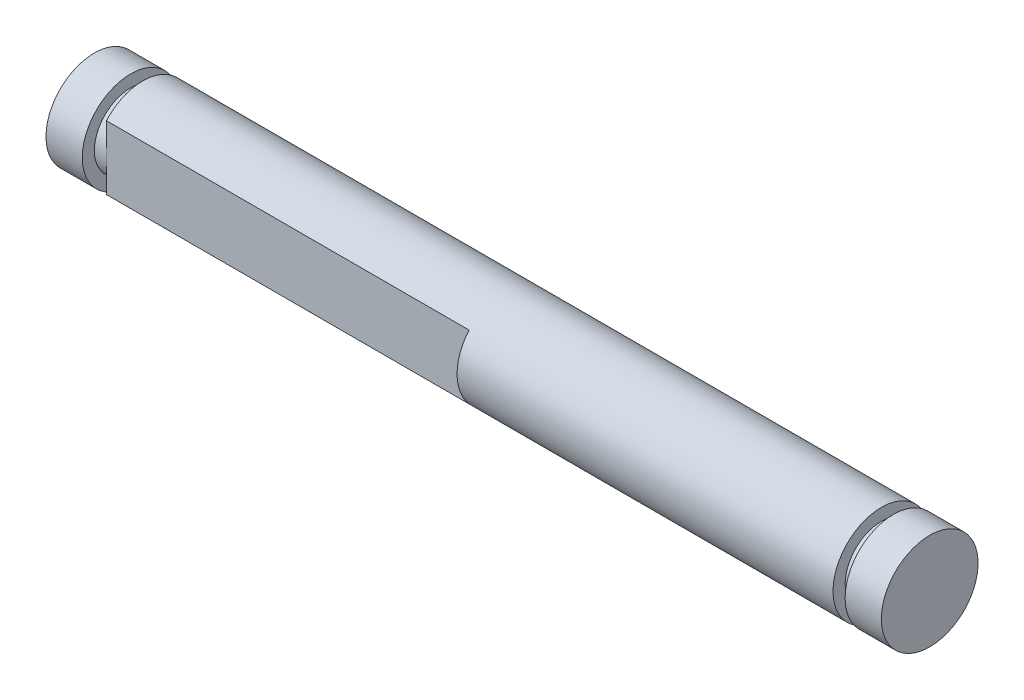
ISO-10303-21;
HEADER;
FILE_DESCRIPTION(('STEP AP214'),'2;1');
FILE_NAME('part.step','',(''),(''),'','','');
FILE_SCHEMA(('AUTOMOTIVE_DESIGN { 1 0 10303 214 1 1 1 1 }'));
ENDSEC;
DATA;
#1=APPLICATION_CONTEXT('core data for automotive mechanical design processes');
#2=APPLICATION_PROTOCOL_DEFINITION('international standard','automotive_design',2000,#1);
#3=PRODUCT_CONTEXT('',#1,'mechanical');
#4=PRODUCT('Part','Part','',(#3));
#5=PRODUCT_RELATED_PRODUCT_CATEGORY('part','',(#4));
#6=PRODUCT_DEFINITION_FORMATION('','',#4);
#7=PRODUCT_DEFINITION_CONTEXT('part definition',#1,'design');
#8=PRODUCT_DEFINITION('design','',#6,#7);
#9=PRODUCT_DEFINITION_SHAPE('','',#8);
#10=(LENGTH_UNIT() NAMED_UNIT(*) SI_UNIT(.MILLI.,.METRE.));
#11=(NAMED_UNIT(*) PLANE_ANGLE_UNIT() SI_UNIT($,.RADIAN.));
#12=(NAMED_UNIT(*) SI_UNIT($,.STERADIAN.) SOLID_ANGLE_UNIT());
#13=UNCERTAINTY_MEASURE_WITH_UNIT(LENGTH_MEASURE(1.E-05),#10,'distance_accuracy_value','');
#14=(GEOMETRIC_REPRESENTATION_CONTEXT(3) GLOBAL_UNCERTAINTY_ASSIGNED_CONTEXT((#13)) GLOBAL_UNIT_ASSIGNED_CONTEXT((#10,
#11,#12)) REPRESENTATION_CONTEXT('',''));
#15=CARTESIAN_POINT('',(0.,0.,0.));
#16=DIRECTION('',(0.,0.,1.));
#17=DIRECTION('',(1.,0.,0.));
#18=AXIS2_PLACEMENT_3D('',#15,#16,#17);
#19=CARTESIAN_POINT('',(-34.55,0.,0.));
#20=DIRECTION('',(1.,0.,0.));
#21=DIRECTION('',(0.,0.,-1.));
#22=AXIS2_PLACEMENT_3D('',#19,#20,#21);
#23=PLANE('',#22);
#24=CARTESIAN_POINT('',(-34.55,0.,0.));
#25=DIRECTION('',(-1.,0.,0.));
#26=DIRECTION('',(0.,0.,1.));
#27=AXIS2_PLACEMENT_3D('',#24,#25,#26);
#28=CIRCLE('',#27,4.);
#29=CARTESIAN_POINT('',(-34.55,0.,4.));
#30=VERTEX_POINT('',#29);
#31=EDGE_CURVE('E63',#30,#30,#28,.T.);
#32=ORIENTED_EDGE('',*,*,#31,.T.);
#33=EDGE_LOOP('',(#32));
#34=FACE_BOUND('',#33,.T.);
#35=ADVANCED_FACE('F32',(#34),#23,.F.);
#36=CARTESIAN_POINT('',(-34.55,0.,0.));
#37=DIRECTION('',(-1.,0.,0.));
#38=DIRECTION('',(0.,0.,1.));
#39=AXIS2_PLACEMENT_3D('',#36,#37,#38);
#40=CYLINDRICAL_SURFACE('',#39,4.);
#41=ORIENTED_EDGE('',*,*,#31,.F.);
#42=EDGE_LOOP('',(#41));
#43=FACE_BOUND('',#42,.T.);
#44=CARTESIAN_POINT('',(-31.55,0.,0.));
#45=DIRECTION('',(-1.,0.,0.));
#46=DIRECTION('',(0.,0.,1.));
#47=AXIS2_PLACEMENT_3D('',#44,#45,#46);
#48=CIRCLE('',#47,4.);
#49=CARTESIAN_POINT('',(-31.55,0.,4.));
#50=VERTEX_POINT('',#49);
#51=EDGE_CURVE('E88',#50,#50,#48,.T.);
#52=ORIENTED_EDGE('',*,*,#51,.T.);
#53=EDGE_LOOP('',(#52));
#54=FACE_BOUND('',#53,.T.);
#55=ADVANCED_FACE('F95',(#43,#54),#40,.T.);
#56=CARTESIAN_POINT('',(-31.55,0.,-4.));
#57=DIRECTION('',(-1.,0.,0.));
#58=DIRECTION('',(0.,0.,1.));
#59=AXIS2_PLACEMENT_3D('',#56,#57,#58);
#60=PLANE('',#59);
#61=ORIENTED_EDGE('',*,*,#51,.F.);
#62=EDGE_LOOP('',(#61));
#63=FACE_BOUND('',#62,.T.);
#64=CARTESIAN_POINT('',(-31.55,0.,0.));
#65=DIRECTION('',(-1.,0.,0.));
#66=DIRECTION('',(0.,0.,1.));
#67=AXIS2_PLACEMENT_3D('',#64,#65,#66);
#68=CIRCLE('',#67,3.00000000000001);
#69=CARTESIAN_POINT('',(-31.55,0.,3.00000000000001));
#70=VERTEX_POINT('',#69);
#71=EDGE_CURVE('E79',#70,#70,#68,.T.);
#72=ORIENTED_EDGE('',*,*,#71,.T.);
#73=EDGE_LOOP('',(#72));
#74=FACE_BOUND('',#73,.T.);
#75=ADVANCED_FACE('F98',(#63,#74),#60,.F.);
#76=CARTESIAN_POINT('',(-34.55,0.,0.));
#77=DIRECTION('',(-1.,0.,0.));
#78=DIRECTION('',(0.,0.,1.));
#79=AXIS2_PLACEMENT_3D('',#76,#77,#78);
#80=CYLINDRICAL_SURFACE('',#79,3.00000000000001);
#81=ORIENTED_EDGE('',*,*,#71,.F.);
#82=EDGE_LOOP('',(#81));
#83=FACE_BOUND('',#82,.T.);
#84=CARTESIAN_POINT('',(-30.55,0.,0.));
#85=DIRECTION('',(-1.,0.,0.));
#86=DIRECTION('',(0.,0.,1.));
#87=AXIS2_PLACEMENT_3D('',#84,#85,#86);
#88=CIRCLE('',#87,3.);
#89=CARTESIAN_POINT('',(-30.55,0.,3.00000000000001));
#90=VERTEX_POINT('',#89);
#91=EDGE_CURVE('E75',#90,#90,#88,.T.);
#92=ORIENTED_EDGE('',*,*,#91,.T.);
#93=EDGE_LOOP('',(#92));
#94=FACE_BOUND('',#93,.T.);
#95=ADVANCED_FACE('F103',(#83,#94),#80,.T.);
#96=CARTESIAN_POINT('',(-30.55,0.,-3.));
#97=DIRECTION('',(1.,0.,0.));
#98=DIRECTION('',(0.,0.,-1.));
#99=AXIS2_PLACEMENT_3D('',#96,#97,#98);
#100=PLANE('',#99);
#101=CARTESIAN_POINT('',(-30.55,0.,0.));
#102=DIRECTION('',(-1.,0.,0.));
#103=DIRECTION('',(0.,0.,1.));
#104=AXIS2_PLACEMENT_3D('',#101,#102,#103);
#105=CIRCLE('',#104,4.00000000000002);
#106=CARTESIAN_POINT('',(-30.55,2.6457513110646,3.00000000000001));
#107=VERTEX_POINT('',#106);
#108=CARTESIAN_POINT('',(-30.55,-2.6457513110646,3.00000000000001));
#109=VERTEX_POINT('',#108);
#110=EDGE_CURVE('E72',#107,#109,#105,.T.);
#111=ORIENTED_EDGE('',*,*,#110,.T.);
#112=DIRECTION('',(0.,1.,0.));
#113=VECTOR('',#112,1.);
#114=CARTESIAN_POINT('',(-30.55,-4.00000000000002,3.00000000000001));
#115=LINE('',#114,#113);
#116=EDGE_CURVE('E112',#109,#90,#115,.T.);
#117=ORIENTED_EDGE('',*,*,#116,.T.);
#118=ORIENTED_EDGE('',*,*,#91,.F.);
#119=EDGE_CURVE('E66',#90,#107,#115,.T.);
#120=ORIENTED_EDGE('',*,*,#119,.T.);
#121=EDGE_LOOP('',(#111,#117,#118,#120));
#122=FACE_BOUND('',#121,.T.);
#123=ADVANCED_FACE('F109',(#122),#100,.F.);
#124=CARTESIAN_POINT('',(-34.55,0.,0.));
#125=DIRECTION('',(-1.,0.,0.));
#126=DIRECTION('',(0.,0.,1.));
#127=AXIS2_PLACEMENT_3D('',#124,#125,#126);
#128=CYLINDRICAL_SURFACE('',#127,4.00000000000001);
#129=ORIENTED_EDGE('',*,*,#110,.F.);
#130=DIRECTION('',(-1.,0.,0.));
#131=VECTOR('',#130,1.);
#132=CARTESIAN_POINT('',(-34.55,2.6457513110646,3.00000000000001));
#133=LINE('',#132,#131);
#134=CARTESIAN_POINT('',(-0.549999999999995,2.64575131106459,3.00000000000001));
#135=VERTEX_POINT('',#134);
#136=EDGE_CURVE('E11',#107,#135,#133,.F.);
#137=ORIENTED_EDGE('',*,*,#136,.T.);
#138=CARTESIAN_POINT('',(-0.549999999999995,0.,0.));
#139=DIRECTION('',(1.,0.,0.));
#140=DIRECTION('',(0.,0.,-1.));
#141=AXIS2_PLACEMENT_3D('',#138,#139,#140);
#142=CIRCLE('',#141,4.00000000000001);
#143=CARTESIAN_POINT('',(-0.549999999999995,-2.64575131106459,3.00000000000001));
#144=VERTEX_POINT('',#143);
#145=EDGE_CURVE('E59',#135,#144,#142,.T.);
#146=ORIENTED_EDGE('',*,*,#145,.T.);
#147=DIRECTION('',(-1.,0.,0.));
#148=VECTOR('',#147,1.);
#149=CARTESIAN_POINT('',(-34.55,-2.6457513110646,3.00000000000001));
#150=LINE('',#149,#148);
#151=EDGE_CURVE('E39',#144,#109,#150,.T.);
#152=ORIENTED_EDGE('',*,*,#151,.T.);
#153=EDGE_LOOP('',(#129,#137,#146,#152));
#154=FACE_BOUND('',#153,.T.);
#155=CARTESIAN_POINT('',(30.55,0.,0.));
#156=DIRECTION('',(-1.,0.,0.));
#157=DIRECTION('',(0.,0.,1.));
#158=AXIS2_PLACEMENT_3D('',#155,#156,#157);
#159=CIRCLE('',#158,4.);
#160=CARTESIAN_POINT('',(30.55,0.,3.99999999999999));
#161=VERTEX_POINT('',#160);
#162=EDGE_CURVE('E76',#161,#161,#159,.T.);
#163=ORIENTED_EDGE('',*,*,#162,.T.);
#164=EDGE_LOOP('',(#163));
#165=FACE_BOUND('',#164,.T.);
#166=ADVANCED_FACE('F69',(#154,#165),#128,.T.);
#167=CARTESIAN_POINT('',(30.55,0.,-4.00000000000002));
#168=DIRECTION('',(-1.,0.,0.));
#169=DIRECTION('',(0.,0.,1.));
#170=AXIS2_PLACEMENT_3D('',#167,#168,#169);
#171=PLANE('',#170);
#172=ORIENTED_EDGE('',*,*,#162,.F.);
#173=EDGE_LOOP('',(#172));
#174=FACE_BOUND('',#173,.T.);
#175=CARTESIAN_POINT('',(30.55,0.,0.));
#176=DIRECTION('',(-1.,0.,0.));
#177=DIRECTION('',(0.,0.,1.));
#178=AXIS2_PLACEMENT_3D('',#175,#176,#177);
#179=CIRCLE('',#178,3.00000000000003);
#180=CARTESIAN_POINT('',(30.55,0.,3.00000000000001));
#181=VERTEX_POINT('',#180);
#182=EDGE_CURVE('E82',#181,#181,#179,.T.);
#183=ORIENTED_EDGE('',*,*,#182,.T.);
#184=EDGE_LOOP('',(#183));
#185=FACE_BOUND('',#184,.T.);
#186=ADVANCED_FACE('F126',(#174,#185),#171,.F.);
#187=CARTESIAN_POINT('',(-34.55,0.,0.));
#188=DIRECTION('',(-1.,0.,0.));
#189=DIRECTION('',(0.,0.,1.));
#190=AXIS2_PLACEMENT_3D('',#187,#188,#189);
#191=CYLINDRICAL_SURFACE('',#190,3.00000000000001);
#192=ORIENTED_EDGE('',*,*,#182,.F.);
#193=EDGE_LOOP('',(#192));
#194=FACE_BOUND('',#193,.T.);
#195=CARTESIAN_POINT('',(31.55,0.,0.));
#196=DIRECTION('',(-1.,0.,0.));
#197=DIRECTION('',(0.,0.,1.));
#198=AXIS2_PLACEMENT_3D('',#195,#196,#197);
#199=CIRCLE('',#198,3.);
#200=CARTESIAN_POINT('',(31.55,0.,2.99999999999999));
#201=VERTEX_POINT('',#200);
#202=EDGE_CURVE('E121',#201,#201,#199,.T.);
#203=ORIENTED_EDGE('',*,*,#202,.T.);
#204=EDGE_LOOP('',(#203));
#205=FACE_BOUND('',#204,.T.);
#206=ADVANCED_FACE('F128',(#194,#205),#191,.T.);
#207=CARTESIAN_POINT('',(31.55,0.,-3.00000000000002));
#208=DIRECTION('',(1.,0.,0.));
#209=DIRECTION('',(0.,0.,-1.));
#210=AXIS2_PLACEMENT_3D('',#207,#208,#209);
#211=PLANE('',#210);
#212=ORIENTED_EDGE('',*,*,#202,.F.);
#213=EDGE_LOOP('',(#212));
#214=FACE_BOUND('',#213,.T.);
#215=CARTESIAN_POINT('',(31.55,0.,0.));
#216=DIRECTION('',(-1.,0.,0.));
#217=DIRECTION('',(0.,0.,1.));
#218=AXIS2_PLACEMENT_3D('',#215,#216,#217);
#219=CIRCLE('',#218,3.99999999999999);
#220=CARTESIAN_POINT('',(31.55,0.,3.99999999999998));
#221=VERTEX_POINT('',#220);
#222=EDGE_CURVE('E116',#221,#221,#219,.T.);
#223=ORIENTED_EDGE('',*,*,#222,.T.);
#224=EDGE_LOOP('',(#223));
#225=FACE_BOUND('',#224,.T.);
#226=ADVANCED_FACE('F131',(#214,#225),#211,.F.);
#227=CARTESIAN_POINT('',(-34.55,0.,0.));
#228=DIRECTION('',(-1.,0.,0.));
#229=DIRECTION('',(0.,0.,1.));
#230=AXIS2_PLACEMENT_3D('',#227,#228,#229);
#231=CYLINDRICAL_SURFACE('',#230,3.99999999999999);
#232=ORIENTED_EDGE('',*,*,#222,.F.);
#233=EDGE_LOOP('',(#232));
#234=FACE_BOUND('',#233,.T.);
#235=CARTESIAN_POINT('',(34.55,0.,0.));
#236=DIRECTION('',(-1.,0.,0.));
#237=DIRECTION('',(0.,0.,1.));
#238=AXIS2_PLACEMENT_3D('',#235,#236,#237);
#239=CIRCLE('',#238,4.);
#240=CARTESIAN_POINT('',(34.55,0.,3.99999999999999));
#241=VERTEX_POINT('',#240);
#242=EDGE_CURVE('E113',#241,#241,#239,.T.);
#243=ORIENTED_EDGE('',*,*,#242,.T.);
#244=EDGE_LOOP('',(#243));
#245=FACE_BOUND('',#244,.T.);
#246=ADVANCED_FACE('F137',(#234,#245),#231,.T.);
#247=CARTESIAN_POINT('',(34.55,0.,-4.00000000000001));
#248=DIRECTION('',(-1.,0.,0.));
#249=DIRECTION('',(0.,0.,1.));
#250=AXIS2_PLACEMENT_3D('',#247,#248,#249);
#251=PLANE('',#250);
#252=ORIENTED_EDGE('',*,*,#242,.F.);
#253=EDGE_LOOP('',(#252));
#254=FACE_BOUND('',#253,.T.);
#255=ADVANCED_FACE('F143',(#254),#251,.F.);
#256=CARTESIAN_POINT('',(-30.55,-4.00000000000002,3.00000000000001));
#257=DIRECTION('',(0.,0.,-1.));
#258=DIRECTION('',(-1.,0.,0.));
#259=AXIS2_PLACEMENT_3D('',#256,#257,#258);
#260=PLANE('',#259);
#261=DIRECTION('',(0.,1.,0.));
#262=VECTOR('',#261,1.);
#263=CARTESIAN_POINT('',(-0.549999999999998,-4.00000000000002,3.00000000000001));
#264=LINE('',#263,#262);
#265=EDGE_CURVE('E45',#144,#135,#264,.T.);
#266=ORIENTED_EDGE('',*,*,#265,.T.);
#267=ORIENTED_EDGE('',*,*,#136,.F.);
#268=ORIENTED_EDGE('',*,*,#119,.F.);
#269=ORIENTED_EDGE('',*,*,#116,.F.);
#270=ORIENTED_EDGE('',*,*,#151,.F.);
#271=EDGE_LOOP('',(#266,#267,#268,#269,#270));
#272=FACE_BOUND('',#271,.T.);
#273=ADVANCED_FACE('F65',(#272),#260,.F.);
#274=CARTESIAN_POINT('',(-0.549999999999998,-4.00000000000002,4.00000000000001));
#275=DIRECTION('',(1.,0.,0.));
#276=DIRECTION('',(0.,0.,-1.));
#277=AXIS2_PLACEMENT_3D('',#274,#275,#276);
#278=PLANE('',#277);
#279=ORIENTED_EDGE('',*,*,#265,.F.);
#280=ORIENTED_EDGE('',*,*,#145,.F.);
#281=EDGE_LOOP('',(#279,#280));
#282=FACE_BOUND('',#281,.T.);
#283=ADVANCED_FACE('F60',(#282),#278,.F.);
#284=CLOSED_SHELL('',(#35,#55,#75,#95,#123,#166,#186,#206,#226,#246,#255,#273,#283));
#285=MANIFOLD_SOLID_BREP('B2',#284);
#286=ADVANCED_BREP_SHAPE_REPRESENTATION('',(#18,#285),#14);
#287=SHAPE_DEFINITION_REPRESENTATION(#9,#286);
ENDSEC;
END-ISO-10303-21;
